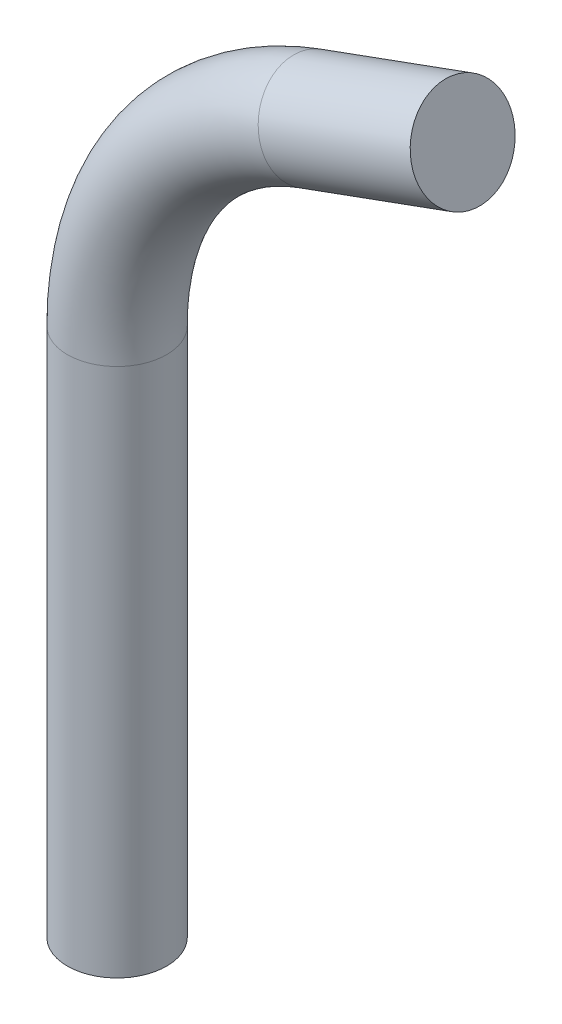
ISO-10303-21;
HEADER;
FILE_DESCRIPTION(('STEP AP214'),'2;1');
FILE_NAME('part.step','',(''),(''),'','','');
FILE_SCHEMA(('AUTOMOTIVE_DESIGN { 1 0 10303 214 1 1 1 1 }'));
ENDSEC;
DATA;
#1=APPLICATION_CONTEXT('core data for automotive mechanical design processes');
#2=APPLICATION_PROTOCOL_DEFINITION('international standard','automotive_design',2000,#1);
#3=PRODUCT_CONTEXT('',#1,'mechanical');
#4=PRODUCT('Part','Part','',(#3));
#5=PRODUCT_RELATED_PRODUCT_CATEGORY('part','',(#4));
#6=PRODUCT_DEFINITION_FORMATION('','',#4);
#7=PRODUCT_DEFINITION_CONTEXT('part definition',#1,'design');
#8=PRODUCT_DEFINITION('design','',#6,#7);
#9=PRODUCT_DEFINITION_SHAPE('','',#8);
#10=(LENGTH_UNIT() NAMED_UNIT(*) SI_UNIT(.MILLI.,.METRE.));
#11=(NAMED_UNIT(*) PLANE_ANGLE_UNIT() SI_UNIT($,.RADIAN.));
#12=(NAMED_UNIT(*) SI_UNIT($,.STERADIAN.) SOLID_ANGLE_UNIT());
#13=UNCERTAINTY_MEASURE_WITH_UNIT(LENGTH_MEASURE(1.E-05),#10,'distance_accuracy_value','');
#14=(GEOMETRIC_REPRESENTATION_CONTEXT(3) GLOBAL_UNCERTAINTY_ASSIGNED_CONTEXT((#13)) GLOBAL_UNIT_ASSIGNED_CONTEXT((#10,
#11,#12)) REPRESENTATION_CONTEXT('',''));
#15=CARTESIAN_POINT('',(0.,0.,0.));
#16=DIRECTION('',(0.,0.,1.));
#17=DIRECTION('',(1.,0.,0.));
#18=AXIS2_PLACEMENT_3D('',#15,#16,#17);
#19=CARTESIAN_POINT('',(0.,0.,0.));
#20=DIRECTION('',(0.,1.,0.));
#21=DIRECTION('',(0.,0.,1.));
#22=AXIS2_PLACEMENT_3D('',#19,#20,#21);
#23=PLANE('',#22);
#24=CARTESIAN_POINT('',(0.,0.,0.));
#25=DIRECTION('',(0.,1.,0.));
#26=DIRECTION('',(0.,0.,1.));
#27=AXIS2_PLACEMENT_3D('',#24,#25,#26);
#28=CIRCLE('',#27,6.75);
#29=CARTESIAN_POINT('',(0.,0.,6.75));
#30=VERTEX_POINT('',#29);
#31=EDGE_CURVE('E46',#30,#30,#28,.T.);
#32=ORIENTED_EDGE('',*,*,#31,.F.);
#33=EDGE_LOOP('',(#32));
#34=FACE_BOUND('',#33,.T.);
#35=ADVANCED_FACE('F34',(#34),#23,.F.);
#36=CARTESIAN_POINT('',(46.9846310392955,117.101007166283,0.));
#37=DIRECTION('',(0.939692620785909,0.342020143325666,0.));
#38=DIRECTION('',(0.,0.,1.));
#39=AXIS2_PLACEMENT_3D('',#36,#37,#38);
#40=PLANE('',#39);
#41=CARTESIAN_POINT('',(46.9846310392955,117.101007166283,0.));
#42=DIRECTION('',(0.939692620785909,0.342020143325666,0.));
#43=DIRECTION('',(0.,0.,1.));
#44=AXIS2_PLACEMENT_3D('',#41,#42,#43);
#45=CIRCLE('',#44,6.75);
#46=CARTESIAN_POINT('',(46.9846310392955,117.101007166283,6.75));
#47=VERTEX_POINT('',#46);
#48=EDGE_CURVE('E11',#47,#47,#45,.T.);
#49=ORIENTED_EDGE('',*,*,#48,.T.);
#50=EDGE_LOOP('',(#49));
#51=FACE_BOUND('',#50,.T.);
#52=ADVANCED_FACE('F49',(#51),#40,.T.);
#53=CARTESIAN_POINT('',(0.,0.,0.));
#54=DIRECTION('',(0.,1.,0.));
#55=DIRECTION('',(0.,0.,1.));
#56=AXIS2_PLACEMENT_3D('',#53,#54,#55);
#57=CYLINDRICAL_SURFACE('',#56,6.75);
#58=CARTESIAN_POINT('',(0.,71.9916984716115,0.));
#59=DIRECTION('',(0.,1.,0.));
#60=DIRECTION('',(0.,0.,1.));
#61=AXIS2_PLACEMENT_3D('',#58,#59,#60);
#62=CIRCLE('',#61,6.75);
#63=CARTESIAN_POINT('',(-6.74999999999999,71.9916984716115,0.));
#64=VERTEX_POINT('',#63);
#65=EDGE_CURVE('E59',#64,#64,#62,.T.);
#66=ORIENTED_EDGE('',*,*,#65,.F.);
#67=EDGE_LOOP('',(#66));
#68=FACE_BOUND('',#67,.T.);
#69=ORIENTED_EDGE('',*,*,#31,.T.);
#70=EDGE_LOOP('',(#69));
#71=FACE_BOUND('',#70,.T.);
#72=ADVANCED_FACE('F64',(#68,#71),#57,.T.);
#73=CARTESIAN_POINT('',(40.,71.9916984716115,0.));
#74=DIRECTION('',(0.,0.,-1.));
#75=DIRECTION('',(-1.,0.,0.));
#76=AXIS2_PLACEMENT_3D('',#73,#74,#75);
#77=TOROIDAL_SURFACE('',#76,40.,6.75);
#78=CARTESIAN_POINT('',(26.3191942669734,109.579403303048,0.));
#79=DIRECTION('',(0.939692620785909,0.342020143325666,0.));
#80=DIRECTION('',(0.,0.,1.));
#81=AXIS2_PLACEMENT_3D('',#78,#79,#80);
#82=CIRCLE('',#81,6.75);
#83=CARTESIAN_POINT('',(24.0105582995251,115.922328493353,0.));
#84=VERTEX_POINT('',#83);
#85=EDGE_CURVE('E41',#84,#84,#82,.T.);
#86=CARTESIAN_POINT('',(40.,71.9916984716115,0.));
#87=DIRECTION('',(0.,0.,-1.));
#88=DIRECTION('',(-1.,0.,0.));
#89=AXIS2_PLACEMENT_3D('',#86,#87,#88);
#90=CIRCLE('',#89,46.75);
#91=EDGE_CURVE('',#64,#84,#90,.T.);
#92=ORIENTED_EDGE('',*,*,#65,.T.);
#93=ORIENTED_EDGE('',*,*,#85,.F.);
#94=ORIENTED_EDGE('',*,*,#91,.T.);
#95=ORIENTED_EDGE('',*,*,#91,.F.);
#96=EDGE_LOOP('',(#92,#94,#93,#95));
#97=FACE_BOUND('',#96,.T.);
#98=ADVANCED_FACE('F54',(#97),#77,.T.);
#99=CARTESIAN_POINT('',(26.3191942669734,109.579403303048,0.));
#100=DIRECTION('',(0.939692620785909,0.342020143325666,0.));
#101=DIRECTION('',(-0.342020143325666,0.939692620785909,0.));
#102=AXIS2_PLACEMENT_3D('',#99,#100,#101);
#103=CYLINDRICAL_SURFACE('',#102,6.75);
#104=ORIENTED_EDGE('',*,*,#48,.F.);
#105=EDGE_LOOP('',(#104));
#106=FACE_BOUND('',#105,.T.);
#107=ORIENTED_EDGE('',*,*,#85,.T.);
#108=EDGE_LOOP('',(#107));
#109=FACE_BOUND('',#108,.T.);
#110=ADVANCED_FACE('F51',(#106,#109),#103,.T.);
#111=CLOSED_SHELL('',(#35,#52,#72,#98,#110));
#112=MANIFOLD_SOLID_BREP('B2',#111);
#113=ADVANCED_BREP_SHAPE_REPRESENTATION('',(#18,#112),#14);
#114=SHAPE_DEFINITION_REPRESENTATION(#9,#113);
ENDSEC;
END-ISO-10303-21;
